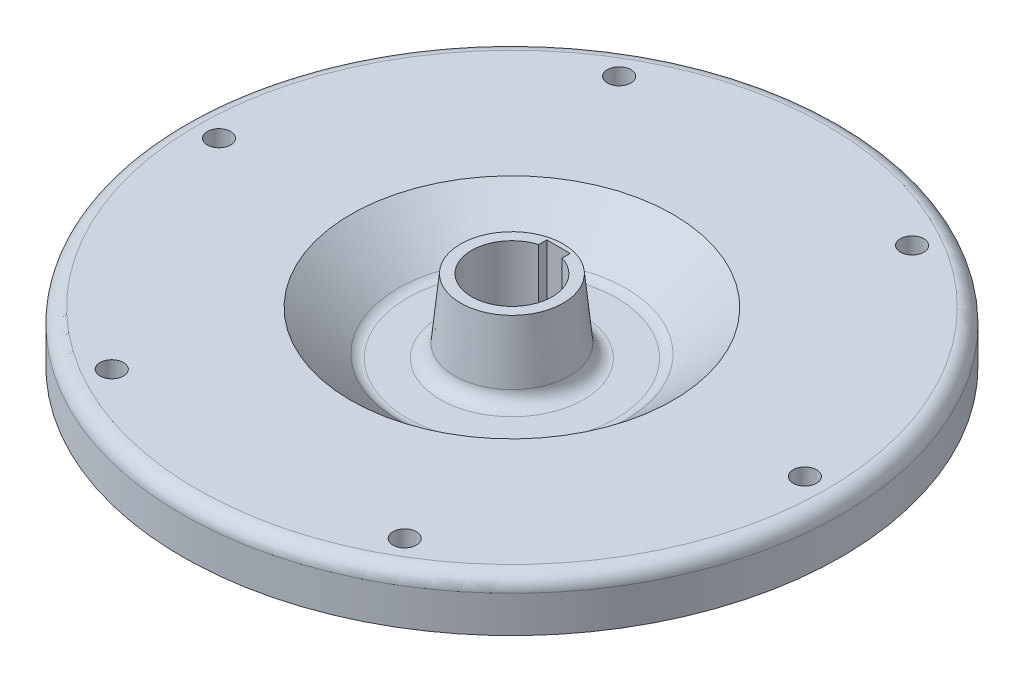
ISO-10303-21;
HEADER;
FILE_DESCRIPTION(('STEP AP214'),'2;1');
FILE_NAME('part.step','',(''),(''),'','','');
FILE_SCHEMA(('AUTOMOTIVE_DESIGN { 1 0 10303 214 1 1 1 1 }'));
ENDSEC;
DATA;
#1=APPLICATION_CONTEXT('core data for automotive mechanical design processes');
#2=APPLICATION_PROTOCOL_DEFINITION('international standard','automotive_design',2000,#1);
#3=PRODUCT_CONTEXT('',#1,'mechanical');
#4=PRODUCT('Part','Part','',(#3));
#5=PRODUCT_RELATED_PRODUCT_CATEGORY('part','',(#4));
#6=PRODUCT_DEFINITION_FORMATION('','',#4);
#7=PRODUCT_DEFINITION_CONTEXT('part definition',#1,'design');
#8=PRODUCT_DEFINITION('design','',#6,#7);
#9=PRODUCT_DEFINITION_SHAPE('','',#8);
#10=(LENGTH_UNIT() NAMED_UNIT(*) SI_UNIT(.MILLI.,.METRE.));
#11=(NAMED_UNIT(*) PLANE_ANGLE_UNIT() SI_UNIT($,.RADIAN.));
#12=(NAMED_UNIT(*) SI_UNIT($,.STERADIAN.) SOLID_ANGLE_UNIT());
#13=UNCERTAINTY_MEASURE_WITH_UNIT(LENGTH_MEASURE(1.E-05),#10,'distance_accuracy_value','');
#14=(GEOMETRIC_REPRESENTATION_CONTEXT(3) GLOBAL_UNCERTAINTY_ASSIGNED_CONTEXT((#13)) GLOBAL_UNIT_ASSIGNED_CONTEXT((#10,
#11,#12)) REPRESENTATION_CONTEXT('',''));
#15=CARTESIAN_POINT('',(0.,0.,0.));
#16=DIRECTION('',(0.,0.,1.));
#17=DIRECTION('',(1.,0.,0.));
#18=AXIS2_PLACEMENT_3D('',#15,#16,#17);
#19=CARTESIAN_POINT('',(0.,0.,0.));
#20=DIRECTION('',(0.,-1.,0.));
#21=DIRECTION('',(0.,0.,-1.));
#22=AXIS2_PLACEMENT_3D('',#19,#20,#21);
#23=CYLINDRICAL_SURFACE('',#22,27.5);
#24=DIRECTION('',(0.,1.,0.));
#25=VECTOR('',#24,1.);
#26=CARTESIAN_POINT('',(-8.,0.,-26.3106442338457));
#27=LINE('',#26,#25);
#28=CARTESIAN_POINT('',(-8.,0.,-26.3106442338457));
#29=VERTEX_POINT('',#28);
#30=CARTESIAN_POINT('',(-8.,160.,-26.3106442338457));
#31=VERTEX_POINT('',#30);
#32=EDGE_CURVE('E62',#29,#31,#27,.T.);
#33=ORIENTED_EDGE('',*,*,#32,.T.);
#34=CARTESIAN_POINT('',(0.,160.,0.));
#35=DIRECTION('',(0.,-1.,0.));
#36=DIRECTION('',(0.,0.,-1.));
#37=AXIS2_PLACEMENT_3D('',#34,#35,#36);
#38=CIRCLE('',#37,27.5);
#39=CARTESIAN_POINT('',(8.,160.,-26.3106442338457));
#40=VERTEX_POINT('',#39);
#41=EDGE_CURVE('E11',#40,#31,#38,.T.);
#42=ORIENTED_EDGE('',*,*,#41,.F.);
#43=DIRECTION('',(0.,1.,0.));
#44=VECTOR('',#43,1.);
#45=CARTESIAN_POINT('',(8.,0.,-26.3106442338457));
#46=LINE('',#45,#44);
#47=CARTESIAN_POINT('',(8.,0.,-26.3106442338457));
#48=VERTEX_POINT('',#47);
#49=EDGE_CURVE('E85',#48,#40,#46,.T.);
#50=ORIENTED_EDGE('',*,*,#49,.F.);
#51=CARTESIAN_POINT('',(0.,0.,0.));
#52=DIRECTION('',(0.,-1.,0.));
#53=DIRECTION('',(0.,0.,-1.));
#54=AXIS2_PLACEMENT_3D('',#51,#52,#53);
#55=CIRCLE('',#54,27.5);
#56=EDGE_CURVE('E94',#48,#29,#55,.T.);
#57=ORIENTED_EDGE('',*,*,#56,.T.);
#58=EDGE_LOOP('',(#33,#42,#50,#57));
#59=FACE_BOUND('',#58,.T.);
#60=ADVANCED_FACE('F37',(#59),#23,.F.);
#61=CARTESIAN_POINT('',(35.,160.,0.));
#62=DIRECTION('',(0.,1.,0.));
#63=DIRECTION('',(0.,0.,1.));
#64=AXIS2_PLACEMENT_3D('',#61,#62,#63);
#65=PLANE('',#64);
#66=DIRECTION('',(0.,0.,1.));
#67=VECTOR('',#66,1.);
#68=CARTESIAN_POINT('',(-8.,160.,-26.3106442338457));
#69=LINE('',#68,#67);
#70=CARTESIAN_POINT('',(-8.,160.,-31.8));
#71=VERTEX_POINT('',#70);
#72=EDGE_CURVE('E77',#71,#31,#69,.T.);
#73=ORIENTED_EDGE('',*,*,#72,.F.);
#74=DIRECTION('',(-1.,0.,0.));
#75=VECTOR('',#74,1.);
#76=CARTESIAN_POINT('',(-8.,160.,-31.8));
#77=LINE('',#76,#75);
#78=CARTESIAN_POINT('',(8.,160.,-31.8));
#79=VERTEX_POINT('',#78);
#80=EDGE_CURVE('E495',#79,#71,#77,.T.);
#81=ORIENTED_EDGE('',*,*,#80,.F.);
#82=DIRECTION('',(0.,0.,-1.));
#83=VECTOR('',#82,1.);
#84=CARTESIAN_POINT('',(8.,160.,-31.8));
#85=LINE('',#84,#83);
#86=EDGE_CURVE('E497',#40,#79,#85,.T.);
#87=ORIENTED_EDGE('',*,*,#86,.F.);
#88=ORIENTED_EDGE('',*,*,#41,.T.);
#89=EDGE_LOOP('',(#73,#81,#87,#88));
#90=FACE_BOUND('',#89,.T.);
#91=CARTESIAN_POINT('',(0.,160.,0.));
#92=DIRECTION('',(0.,-1.,0.));
#93=DIRECTION('',(0.,0.,-1.));
#94=AXIS2_PLACEMENT_3D('',#91,#92,#93);
#95=CIRCLE('',#94,35.);
#96=CARTESIAN_POINT('',(0.,160.,-35.));
#97=VERTEX_POINT('',#96);
#98=EDGE_CURVE('E45',#97,#97,#95,.T.);
#99=ORIENTED_EDGE('',*,*,#98,.F.);
#100=EDGE_LOOP('',(#99));
#101=FACE_BOUND('',#100,.T.);
#102=ADVANCED_FACE('F226',(#90,#101),#65,.T.);
#103=CARTESIAN_POINT('',(0.,119.00496280979,0.));
#104=DIRECTION('',(0.,-1.,0.));
#105=DIRECTION('',(0.,0.,-1.));
#106=AXIS2_PLACEMENT_3D('',#103,#104,#105);
#107=CONICAL_SURFACE('',#106,39.099503719021,0.0996686524911624);
#108=ORIENTED_EDGE('',*,*,#98,.T.);
#109=EDGE_LOOP('',(#108));
#110=FACE_BOUND('',#109,.T.);
#111=CARTESIAN_POINT('',(0.,119.00496280979,0.));
#112=DIRECTION('',(0.,-1.,0.));
#113=DIRECTION('',(0.,0.,-1.));
#114=AXIS2_PLACEMENT_3D('',#111,#112,#113);
#115=CIRCLE('',#114,39.099503719021);
#116=CARTESIAN_POINT('',(0.,119.00496280979,-39.099503719021));
#117=VERTEX_POINT('',#116);
#118=EDGE_CURVE('E145',#117,#117,#115,.T.);
#119=ORIENTED_EDGE('',*,*,#118,.F.);
#120=EDGE_LOOP('',(#119));
#121=FACE_BOUND('',#120,.T.);
#122=ADVANCED_FACE('F230',(#110,#121),#107,.T.);
#123=CARTESIAN_POINT('',(0.,120.,0.));
#124=DIRECTION('',(0.,-1.,0.));
#125=DIRECTION('',(0.,0.,-1.));
#126=AXIS2_PLACEMENT_3D('',#123,#124,#125);
#127=TOROIDAL_SURFACE('',#126,49.0498756211209,10.);
#128=ORIENTED_EDGE('',*,*,#118,.T.);
#129=EDGE_LOOP('',(#128));
#130=FACE_BOUND('',#129,.T.);
#131=CARTESIAN_POINT('',(0.,110.,0.));
#132=DIRECTION('',(0.,-1.,0.));
#133=DIRECTION('',(0.,0.,-1.));
#134=AXIS2_PLACEMENT_3D('',#131,#132,#133);
#135=CIRCLE('',#134,49.0498756211209);
#136=CARTESIAN_POINT('',(0.,110.,-49.0498756211209));
#137=VERTEX_POINT('',#136);
#138=EDGE_CURVE('E142',#137,#137,#135,.T.);
#139=ORIENTED_EDGE('',*,*,#138,.F.);
#140=EDGE_LOOP('',(#139));
#141=FACE_BOUND('',#140,.T.);
#142=ADVANCED_FACE('F235',(#130,#141),#127,.F.);
#143=CARTESIAN_POINT('',(71.3007592378452,110.,0.));
#144=DIRECTION('',(0.,1.,0.));
#145=DIRECTION('',(0.,0.,1.));
#146=AXIS2_PLACEMENT_3D('',#143,#144,#145);
#147=PLANE('',#146);
#148=ORIENTED_EDGE('',*,*,#138,.T.);
#149=EDGE_LOOP('',(#148));
#150=FACE_BOUND('',#149,.T.);
#151=CARTESIAN_POINT('',(0.,110.,0.));
#152=DIRECTION('',(0.,-1.,0.));
#153=DIRECTION('',(0.,0.,-1.));
#154=AXIS2_PLACEMENT_3D('',#151,#152,#153);
#155=CIRCLE('',#154,71.3007592378452);
#156=CARTESIAN_POINT('',(0.,110.,-71.3007592378452));
#157=VERTEX_POINT('',#156);
#158=EDGE_CURVE('E139',#157,#157,#155,.T.);
#159=ORIENTED_EDGE('',*,*,#158,.F.);
#160=EDGE_LOOP('',(#159));
#161=FACE_BOUND('',#160,.T.);
#162=ADVANCED_FACE('F242',(#150,#161),#147,.T.);
#163=CARTESIAN_POINT('',(0.,120.,0.));
#164=DIRECTION('',(0.,-1.,0.));
#165=DIRECTION('',(0.,0.,-1.));
#166=AXIS2_PLACEMENT_3D('',#163,#164,#165);
#167=TOROIDAL_SURFACE('',#166,71.3007592378452,10.);
#168=ORIENTED_EDGE('',*,*,#158,.T.);
#169=EDGE_LOOP('',(#168));
#170=FACE_BOUND('',#169,.T.);
#171=CARTESIAN_POINT('',(0.,112.407433976347,0.));
#172=DIRECTION('',(0.,-1.,0.));
#173=DIRECTION('',(0.,0.,-1.));
#174=AXIS2_PLACEMENT_3D('',#171,#172,#173);
#175=CIRCLE('',#174,77.8086729724048);
#176=CARTESIAN_POINT('',(0.,112.407433976347,-77.8086729724048));
#177=VERTEX_POINT('',#176);
#178=EDGE_CURVE('E136',#177,#177,#175,.T.);
#179=ORIENTED_EDGE('',*,*,#178,.F.);
#180=EDGE_LOOP('',(#179));
#181=FACE_BOUND('',#180,.T.);
#182=ADVANCED_FACE('F246',(#170,#181),#167,.F.);
#183=CARTESIAN_POINT('',(0.,140.,0.));
#184=DIRECTION('',(0.,1.,0.));
#185=DIRECTION('',(0.,0.,1.));
#186=AXIS2_PLACEMENT_3D('',#183,#184,#185);
#187=CONICAL_SURFACE('',#186,110.,0.862170054667227);
#188=ORIENTED_EDGE('',*,*,#178,.T.);
#189=EDGE_LOOP('',(#188));
#190=FACE_BOUND('',#189,.T.);
#191=CARTESIAN_POINT('',(0.,140.,0.));
#192=DIRECTION('',(0.,-1.,0.));
#193=DIRECTION('',(0.,0.,-1.));
#194=AXIS2_PLACEMENT_3D('',#191,#192,#193);
#195=CIRCLE('',#194,110.);
#196=CARTESIAN_POINT('',(0.,140.,-110.));
#197=VERTEX_POINT('',#196);
#198=EDGE_CURVE('E133',#197,#197,#195,.T.);
#199=ORIENTED_EDGE('',*,*,#198,.F.);
#200=EDGE_LOOP('',(#199));
#201=FACE_BOUND('',#200,.T.);
#202=ADVANCED_FACE('F250',(#190,#201),#187,.F.);
#203=CARTESIAN_POINT('',(215.,140.,0.));
#204=DIRECTION('',(0.,1.,0.));
#205=DIRECTION('',(0.,0.,1.));
#206=AXIS2_PLACEMENT_3D('',#203,#204,#205);
#207=PLANE('',#206);
#208=CARTESIAN_POINT('',(200.,140.,0.));
#209=DIRECTION('',(0.,1.,0.));
#210=DIRECTION('',(0.,0.,1.));
#211=AXIS2_PLACEMENT_3D('',#208,#209,#210);
#212=CIRCLE('',#211,8.00000000000001);
#213=CARTESIAN_POINT('',(200.,140.,8.00000000000001));
#214=VERTEX_POINT('',#213);
#215=EDGE_CURVE('E154',#214,#214,#212,.T.);
#216=ORIENTED_EDGE('',*,*,#215,.F.);
#217=EDGE_LOOP('',(#216));
#218=FACE_BOUND('',#217,.T.);
#219=CARTESIAN_POINT('',(99.9999999999999,140.,-173.205080756888));
#220=DIRECTION('',(0.,1.,0.));
#221=DIRECTION('',(0.,0.,1.));
#222=AXIS2_PLACEMENT_3D('',#219,#220,#221);
#223=CIRCLE('',#222,8.00000000000003);
#224=CARTESIAN_POINT('',(99.9999999999999,140.,-165.205080756888));
#225=VERTEX_POINT('',#224);
#226=EDGE_CURVE('E503',#225,#225,#223,.T.);
#227=ORIENTED_EDGE('',*,*,#226,.F.);
#228=EDGE_LOOP('',(#227));
#229=FACE_BOUND('',#228,.T.);
#230=CARTESIAN_POINT('',(-100.,140.,-173.205080756888));
#231=DIRECTION('',(0.,1.,0.));
#232=DIRECTION('',(0.,0.,1.));
#233=AXIS2_PLACEMENT_3D('',#230,#231,#232);
#234=CIRCLE('',#233,8.00000000000001);
#235=CARTESIAN_POINT('',(-100.,140.,-165.205080756888));
#236=VERTEX_POINT('',#235);
#237=EDGE_CURVE('E107',#236,#236,#234,.T.);
#238=ORIENTED_EDGE('',*,*,#237,.F.);
#239=EDGE_LOOP('',(#238));
#240=FACE_BOUND('',#239,.T.);
#241=CARTESIAN_POINT('',(-200.,140.,0.));
#242=DIRECTION('',(0.,1.,0.));
#243=DIRECTION('',(0.,0.,1.));
#244=AXIS2_PLACEMENT_3D('',#241,#242,#243);
#245=CIRCLE('',#244,8.00000000000004);
#246=CARTESIAN_POINT('',(-200.,140.,8.00000000000007));
#247=VERTEX_POINT('',#246);
#248=EDGE_CURVE('E515',#247,#247,#245,.T.);
#249=ORIENTED_EDGE('',*,*,#248,.F.);
#250=EDGE_LOOP('',(#249));
#251=FACE_BOUND('',#250,.T.);
#252=CARTESIAN_POINT('',(-100.,140.,173.205080756888));
#253=DIRECTION('',(0.,1.,0.));
#254=DIRECTION('',(0.,0.,1.));
#255=AXIS2_PLACEMENT_3D('',#252,#253,#254);
#256=CIRCLE('',#255,8.00000000000001);
#257=CARTESIAN_POINT('',(-100.,140.,181.205080756888));
#258=VERTEX_POINT('',#257);
#259=EDGE_CURVE('E513',#258,#258,#256,.T.);
#260=ORIENTED_EDGE('',*,*,#259,.F.);
#261=EDGE_LOOP('',(#260));
#262=FACE_BOUND('',#261,.T.);
#263=CARTESIAN_POINT('',(100.,140.,173.205080756888));
#264=DIRECTION('',(0.,1.,0.));
#265=DIRECTION('',(0.,0.,1.));
#266=AXIS2_PLACEMENT_3D('',#263,#264,#265);
#267=CIRCLE('',#266,8.00000000000001);
#268=CARTESIAN_POINT('',(100.,140.,181.205080756888));
#269=VERTEX_POINT('',#268);
#270=EDGE_CURVE('E508',#269,#269,#267,.T.);
#271=ORIENTED_EDGE('',*,*,#270,.F.);
#272=EDGE_LOOP('',(#271));
#273=FACE_BOUND('',#272,.T.);
#274=ORIENTED_EDGE('',*,*,#198,.T.);
#275=EDGE_LOOP('',(#274));
#276=FACE_BOUND('',#275,.T.);
#277=CARTESIAN_POINT('',(0.,140.,0.));
#278=DIRECTION('',(0.,-1.,0.));
#279=DIRECTION('',(0.,0.,-1.));
#280=AXIS2_PLACEMENT_3D('',#277,#278,#279);
#281=CIRCLE('',#280,215.);
#282=CARTESIAN_POINT('',(0.,140.,-215.));
#283=VERTEX_POINT('',#282);
#284=EDGE_CURVE('E130',#283,#283,#281,.T.);
#285=ORIENTED_EDGE('',*,*,#284,.F.);
#286=EDGE_LOOP('',(#285));
#287=FACE_BOUND('',#286,.T.);
#288=ADVANCED_FACE('F254',(#218,#229,#240,#251,#262,#273,#276,#287),#207,.T.);
#289=CARTESIAN_POINT('',(0.,130.,0.));
#290=DIRECTION('',(0.,-1.,0.));
#291=DIRECTION('',(0.,0.,-1.));
#292=AXIS2_PLACEMENT_3D('',#289,#290,#291);
#293=TOROIDAL_SURFACE('',#292,215.,9.99999999999999);
#294=ORIENTED_EDGE('',*,*,#284,.T.);
#295=EDGE_LOOP('',(#294));
#296=FACE_BOUND('',#295,.T.);
#297=CARTESIAN_POINT('',(0.,130.,0.));
#298=DIRECTION('',(0.,-1.,0.));
#299=DIRECTION('',(0.,0.,-1.));
#300=AXIS2_PLACEMENT_3D('',#297,#298,#299);
#301=CIRCLE('',#300,225.);
#302=CARTESIAN_POINT('',(0.,130.,-225.));
#303=VERTEX_POINT('',#302);
#304=EDGE_CURVE('E127',#303,#303,#301,.T.);
#305=ORIENTED_EDGE('',*,*,#304,.F.);
#306=EDGE_LOOP('',(#305));
#307=FACE_BOUND('',#306,.T.);
#308=ADVANCED_FACE('F258',(#296,#307),#293,.T.);
#309=CARTESIAN_POINT('',(0.,0.,0.));
#310=DIRECTION('',(0.,-1.,0.));
#311=DIRECTION('',(0.,0.,-1.));
#312=AXIS2_PLACEMENT_3D('',#309,#310,#311);
#313=CYLINDRICAL_SURFACE('',#312,225.);
#314=ORIENTED_EDGE('',*,*,#304,.T.);
#315=EDGE_LOOP('',(#314));
#316=FACE_BOUND('',#315,.T.);
#317=CARTESIAN_POINT('',(0.,105.,0.));
#318=DIRECTION('',(0.,-1.,0.));
#319=DIRECTION('',(0.,0.,-1.));
#320=AXIS2_PLACEMENT_3D('',#317,#318,#319);
#321=CIRCLE('',#320,225.);
#322=CARTESIAN_POINT('',(0.,105.,-225.));
#323=VERTEX_POINT('',#322);
#324=EDGE_CURVE('E124',#323,#323,#321,.T.);
#325=ORIENTED_EDGE('',*,*,#324,.F.);
#326=EDGE_LOOP('',(#325));
#327=FACE_BOUND('',#326,.T.);
#328=ADVANCED_FACE('F172',(#316,#327),#313,.T.);
#329=CARTESIAN_POINT('',(175.,105.,0.));
#330=DIRECTION('',(0.,-1.,0.));
#331=DIRECTION('',(0.,0.,-1.));
#332=AXIS2_PLACEMENT_3D('',#329,#330,#331);
#333=PLANE('',#332);
#334=CARTESIAN_POINT('',(200.,105.,0.));
#335=DIRECTION('',(0.,-1.,0.));
#336=DIRECTION('',(0.,0.,-1.));
#337=AXIS2_PLACEMENT_3D('',#334,#335,#336);
#338=CIRCLE('',#337,8.00000000000001);
#339=CARTESIAN_POINT('',(200.,105.,-8.00000000000001));
#340=VERTEX_POINT('',#339);
#341=EDGE_CURVE('E40',#340,#340,#338,.T.);
#342=ORIENTED_EDGE('',*,*,#341,.F.);
#343=EDGE_LOOP('',(#342));
#344=FACE_BOUND('',#343,.T.);
#345=CARTESIAN_POINT('',(99.9999999999999,105.,-173.205080756888));
#346=DIRECTION('',(0.,-1.,0.));
#347=DIRECTION('',(0.,0.,-1.));
#348=AXIS2_PLACEMENT_3D('',#345,#346,#347);
#349=CIRCLE('',#348,8.00000000000003);
#350=CARTESIAN_POINT('',(99.9999999999999,105.,-181.205080756888));
#351=VERTEX_POINT('',#350);
#352=EDGE_CURVE('E105',#351,#351,#349,.T.);
#353=ORIENTED_EDGE('',*,*,#352,.F.);
#354=EDGE_LOOP('',(#353));
#355=FACE_BOUND('',#354,.T.);
#356=CARTESIAN_POINT('',(-100.,105.,-173.205080756888));
#357=DIRECTION('',(0.,-1.,0.));
#358=DIRECTION('',(0.,0.,-1.));
#359=AXIS2_PLACEMENT_3D('',#356,#357,#358);
#360=CIRCLE('',#359,8.00000000000001);
#361=CARTESIAN_POINT('',(-100.,105.,-181.205080756888));
#362=VERTEX_POINT('',#361);
#363=EDGE_CURVE('E160',#362,#362,#360,.T.);
#364=ORIENTED_EDGE('',*,*,#363,.F.);
#365=EDGE_LOOP('',(#364));
#366=FACE_BOUND('',#365,.T.);
#367=CARTESIAN_POINT('',(-200.,105.,0.));
#368=DIRECTION('',(0.,-1.,0.));
#369=DIRECTION('',(0.,0.,-1.));
#370=AXIS2_PLACEMENT_3D('',#367,#368,#369);
#371=CIRCLE('',#370,8.00000000000004);
#372=CARTESIAN_POINT('',(-200.,105.,-8.00000000000001));
#373=VERTEX_POINT('',#372);
#374=EDGE_CURVE('E157',#373,#373,#371,.T.);
#375=ORIENTED_EDGE('',*,*,#374,.F.);
#376=EDGE_LOOP('',(#375));
#377=FACE_BOUND('',#376,.T.);
#378=CARTESIAN_POINT('',(-100.,105.,173.205080756888));
#379=DIRECTION('',(0.,-1.,0.));
#380=DIRECTION('',(0.,0.,-1.));
#381=AXIS2_PLACEMENT_3D('',#378,#379,#380);
#382=CIRCLE('',#381,8.00000000000001);
#383=CARTESIAN_POINT('',(-100.,105.,165.205080756888));
#384=VERTEX_POINT('',#383);
#385=EDGE_CURVE('E153',#384,#384,#382,.T.);
#386=ORIENTED_EDGE('',*,*,#385,.F.);
#387=EDGE_LOOP('',(#386));
#388=FACE_BOUND('',#387,.T.);
#389=CARTESIAN_POINT('',(100.,105.,173.205080756888));
#390=DIRECTION('',(0.,-1.,0.));
#391=DIRECTION('',(0.,0.,-1.));
#392=AXIS2_PLACEMENT_3D('',#389,#390,#391);
#393=CIRCLE('',#392,8.00000000000001);
#394=CARTESIAN_POINT('',(100.,105.,165.205080756888));
#395=VERTEX_POINT('',#394);
#396=EDGE_CURVE('E150',#395,#395,#393,.T.);
#397=ORIENTED_EDGE('',*,*,#396,.F.);
#398=EDGE_LOOP('',(#397));
#399=FACE_BOUND('',#398,.T.);
#400=ORIENTED_EDGE('',*,*,#324,.T.);
#401=EDGE_LOOP('',(#400));
#402=FACE_BOUND('',#401,.T.);
#403=CARTESIAN_POINT('',(0.,105.,0.));
#404=DIRECTION('',(0.,-1.,0.));
#405=DIRECTION('',(0.,0.,-1.));
#406=AXIS2_PLACEMENT_3D('',#403,#404,#405);
#407=CIRCLE('',#406,175.);
#408=CARTESIAN_POINT('',(0.,105.,-175.));
#409=VERTEX_POINT('',#408);
#410=EDGE_CURVE('E121',#409,#409,#407,.T.);
#411=ORIENTED_EDGE('',*,*,#410,.F.);
#412=EDGE_LOOP('',(#411));
#413=FACE_BOUND('',#412,.T.);
#414=ADVANCED_FACE('F168',(#344,#355,#366,#377,#388,#399,#402,#413),#333,.T.);
#415=CARTESIAN_POINT('',(0.,0.,0.));
#416=DIRECTION('',(0.,-1.,0.));
#417=DIRECTION('',(0.,0.,-1.));
#418=AXIS2_PLACEMENT_3D('',#415,#416,#417);
#419=CYLINDRICAL_SURFACE('',#418,175.);
#420=ORIENTED_EDGE('',*,*,#410,.T.);
#421=EDGE_LOOP('',(#420));
#422=FACE_BOUND('',#421,.T.);
#423=CARTESIAN_POINT('',(0.,70.,0.));
#424=DIRECTION('',(0.,-1.,0.));
#425=DIRECTION('',(0.,0.,-1.));
#426=AXIS2_PLACEMENT_3D('',#423,#424,#425);
#427=CIRCLE('',#426,175.);
#428=CARTESIAN_POINT('',(0.,70.,-175.));
#429=VERTEX_POINT('',#428);
#430=EDGE_CURVE('E118',#429,#429,#427,.T.);
#431=ORIENTED_EDGE('',*,*,#430,.F.);
#432=EDGE_LOOP('',(#431));
#433=FACE_BOUND('',#432,.T.);
#434=ADVANCED_FACE('F171',(#422,#433),#419,.T.);
#435=CARTESIAN_POINT('',(110.,70.,0.));
#436=DIRECTION('',(0.,-1.,0.));
#437=DIRECTION('',(0.,0.,-1.));
#438=AXIS2_PLACEMENT_3D('',#435,#436,#437);
#439=PLANE('',#438);
#440=ORIENTED_EDGE('',*,*,#430,.T.);
#441=EDGE_LOOP('',(#440));
#442=FACE_BOUND('',#441,.T.);
#443=CARTESIAN_POINT('',(0.,70.,0.));
#444=DIRECTION('',(0.,-1.,0.));
#445=DIRECTION('',(0.,0.,-1.));
#446=AXIS2_PLACEMENT_3D('',#443,#444,#445);
#447=CIRCLE('',#446,110.);
#448=CARTESIAN_POINT('',(0.,70.,-110.));
#449=VERTEX_POINT('',#448);
#450=EDGE_CURVE('E115',#449,#449,#447,.T.);
#451=ORIENTED_EDGE('',*,*,#450,.F.);
#452=EDGE_LOOP('',(#451));
#453=FACE_BOUND('',#452,.T.);
#454=ADVANCED_FACE('F189',(#442,#453),#439,.T.);
#455=CARTESIAN_POINT('',(0.,35.,0.));
#456=DIRECTION('',(0.,-1.,0.));
#457=DIRECTION('',(0.,0.,-1.));
#458=AXIS2_PLACEMENT_3D('',#455,#456,#457);
#459=TOROIDAL_SURFACE('',#458,110.,35.);
#460=ORIENTED_EDGE('',*,*,#450,.T.);
#461=EDGE_LOOP('',(#460));
#462=FACE_BOUND('',#461,.T.);
#463=CARTESIAN_POINT('',(0.,35.,0.));
#464=DIRECTION('',(0.,-1.,0.));
#465=DIRECTION('',(0.,0.,-1.));
#466=AXIS2_PLACEMENT_3D('',#463,#464,#465);
#467=CIRCLE('',#466,75.);
#468=CARTESIAN_POINT('',(0.,35.,-75.));
#469=VERTEX_POINT('',#468);
#470=EDGE_CURVE('E112',#469,#469,#467,.T.);
#471=ORIENTED_EDGE('',*,*,#470,.F.);
#472=EDGE_LOOP('',(#471));
#473=FACE_BOUND('',#472,.T.);
#474=ADVANCED_FACE('F195',(#462,#473),#459,.F.);
#475=CARTESIAN_POINT('',(0.,0.,0.));
#476=DIRECTION('',(0.,-1.,0.));
#477=DIRECTION('',(0.,0.,-1.));
#478=AXIS2_PLACEMENT_3D('',#475,#476,#477);
#479=CYLINDRICAL_SURFACE('',#478,75.);
#480=ORIENTED_EDGE('',*,*,#470,.T.);
#481=EDGE_LOOP('',(#480));
#482=FACE_BOUND('',#481,.T.);
#483=CARTESIAN_POINT('',(0.,10.,0.));
#484=DIRECTION('',(0.,-1.,0.));
#485=DIRECTION('',(0.,0.,-1.));
#486=AXIS2_PLACEMENT_3D('',#483,#484,#485);
#487=CIRCLE('',#486,75.);
#488=CARTESIAN_POINT('',(0.,10.,-75.));
#489=VERTEX_POINT('',#488);
#490=EDGE_CURVE('E102',#489,#489,#487,.T.);
#491=ORIENTED_EDGE('',*,*,#490,.F.);
#492=EDGE_LOOP('',(#491));
#493=FACE_BOUND('',#492,.T.);
#494=ADVANCED_FACE('F201',(#482,#493),#479,.T.);
#495=CARTESIAN_POINT('',(0.,10.,0.));
#496=DIRECTION('',(0.,-1.,0.));
#497=DIRECTION('',(0.,0.,-1.));
#498=AXIS2_PLACEMENT_3D('',#495,#496,#497);
#499=TOROIDAL_SURFACE('',#498,65.,10.);
#500=ORIENTED_EDGE('',*,*,#490,.T.);
#501=EDGE_LOOP('',(#500));
#502=FACE_BOUND('',#501,.T.);
#503=CARTESIAN_POINT('',(0.,0.,0.));
#504=DIRECTION('',(0.,-1.,0.));
#505=DIRECTION('',(0.,0.,-1.));
#506=AXIS2_PLACEMENT_3D('',#503,#504,#505);
#507=CIRCLE('',#506,64.9999999999999);
#508=CARTESIAN_POINT('',(0.,0.,-64.9999999999999));
#509=VERTEX_POINT('',#508);
#510=EDGE_CURVE('E99',#509,#509,#507,.T.);
#511=ORIENTED_EDGE('',*,*,#510,.F.);
#512=EDGE_LOOP('',(#511));
#513=FACE_BOUND('',#512,.T.);
#514=ADVANCED_FACE('F207',(#502,#513),#499,.T.);
#515=CARTESIAN_POINT('',(27.5,0.,0.));
#516=DIRECTION('',(0.,-1.,0.));
#517=DIRECTION('',(0.,0.,-1.));
#518=AXIS2_PLACEMENT_3D('',#515,#516,#517);
#519=PLANE('',#518);
#520=DIRECTION('',(0.,0.,1.));
#521=VECTOR('',#520,1.);
#522=CARTESIAN_POINT('',(-8.,0.,-26.3106442338457));
#523=LINE('',#522,#521);
#524=CARTESIAN_POINT('',(-8.,0.,-31.8));
#525=VERTEX_POINT('',#524);
#526=EDGE_CURVE('E95',#525,#29,#523,.T.);
#527=ORIENTED_EDGE('',*,*,#526,.T.);
#528=ORIENTED_EDGE('',*,*,#56,.F.);
#529=DIRECTION('',(0.,0.,-1.));
#530=VECTOR('',#529,1.);
#531=CARTESIAN_POINT('',(8.,0.,-31.8));
#532=LINE('',#531,#530);
#533=CARTESIAN_POINT('',(8.,0.,-31.8));
#534=VERTEX_POINT('',#533);
#535=EDGE_CURVE('E81',#48,#534,#532,.T.);
#536=ORIENTED_EDGE('',*,*,#535,.T.);
#537=DIRECTION('',(-1.,0.,0.));
#538=VECTOR('',#537,1.);
#539=CARTESIAN_POINT('',(-8.,0.,-31.8));
#540=LINE('',#539,#538);
#541=EDGE_CURVE('E53',#534,#525,#540,.T.);
#542=ORIENTED_EDGE('',*,*,#541,.T.);
#543=EDGE_LOOP('',(#527,#528,#536,#542));
#544=FACE_BOUND('',#543,.T.);
#545=ORIENTED_EDGE('',*,*,#510,.T.);
#546=EDGE_LOOP('',(#545));
#547=FACE_BOUND('',#546,.T.);
#548=ADVANCED_FACE('F97',(#544,#547),#519,.T.);
#549=CARTESIAN_POINT('',(100.,0.,173.205080756888));
#550=DIRECTION('',(0.,1.,0.));
#551=DIRECTION('',(0.,0.,1.));
#552=AXIS2_PLACEMENT_3D('',#549,#550,#551);
#553=CYLINDRICAL_SURFACE('',#552,8.00000000000001);
#554=ORIENTED_EDGE('',*,*,#396,.T.);
#555=EDGE_LOOP('',(#554));
#556=FACE_BOUND('',#555,.T.);
#557=ORIENTED_EDGE('',*,*,#270,.T.);
#558=EDGE_LOOP('',(#557));
#559=FACE_BOUND('',#558,.T.);
#560=ADVANCED_FACE('F216',(#556,#559),#553,.F.);
#561=CARTESIAN_POINT('',(-100.,0.,173.205080756888));
#562=DIRECTION('',(0.,1.,0.));
#563=DIRECTION('',(0.,0.,1.));
#564=AXIS2_PLACEMENT_3D('',#561,#562,#563);
#565=CYLINDRICAL_SURFACE('',#564,8.00000000000001);
#566=ORIENTED_EDGE('',*,*,#385,.T.);
#567=EDGE_LOOP('',(#566));
#568=FACE_BOUND('',#567,.T.);
#569=ORIENTED_EDGE('',*,*,#259,.T.);
#570=EDGE_LOOP('',(#569));
#571=FACE_BOUND('',#570,.T.);
#572=ADVANCED_FACE('F221',(#568,#571),#565,.F.);
#573=CARTESIAN_POINT('',(-200.,0.,0.));
#574=DIRECTION('',(0.,1.,0.));
#575=DIRECTION('',(0.,0.,1.));
#576=AXIS2_PLACEMENT_3D('',#573,#574,#575);
#577=CYLINDRICAL_SURFACE('',#576,8.00000000000004);
#578=ORIENTED_EDGE('',*,*,#374,.T.);
#579=EDGE_LOOP('',(#578));
#580=FACE_BOUND('',#579,.T.);
#581=ORIENTED_EDGE('',*,*,#248,.T.);
#582=EDGE_LOOP('',(#581));
#583=FACE_BOUND('',#582,.T.);
#584=ADVANCED_FACE('F400',(#580,#583),#577,.F.);
#585=CARTESIAN_POINT('',(-100.,0.,-173.205080756888));
#586=DIRECTION('',(0.,1.,0.));
#587=DIRECTION('',(0.,0.,1.));
#588=AXIS2_PLACEMENT_3D('',#585,#586,#587);
#589=CYLINDRICAL_SURFACE('',#588,8.00000000000001);
#590=ORIENTED_EDGE('',*,*,#363,.T.);
#591=EDGE_LOOP('',(#590));
#592=FACE_BOUND('',#591,.T.);
#593=ORIENTED_EDGE('',*,*,#237,.T.);
#594=EDGE_LOOP('',(#593));
#595=FACE_BOUND('',#594,.T.);
#596=ADVANCED_FACE('F410',(#592,#595),#589,.F.);
#597=CARTESIAN_POINT('',(99.9999999999999,0.,-173.205080756888));
#598=DIRECTION('',(0.,1.,0.));
#599=DIRECTION('',(0.,0.,1.));
#600=AXIS2_PLACEMENT_3D('',#597,#598,#599);
#601=CYLINDRICAL_SURFACE('',#600,8.00000000000003);
#602=ORIENTED_EDGE('',*,*,#352,.T.);
#603=EDGE_LOOP('',(#602));
#604=FACE_BOUND('',#603,.T.);
#605=ORIENTED_EDGE('',*,*,#226,.T.);
#606=EDGE_LOOP('',(#605));
#607=FACE_BOUND('',#606,.T.);
#608=ADVANCED_FACE('F165',(#604,#607),#601,.F.);
#609=CARTESIAN_POINT('',(200.,0.,0.));
#610=DIRECTION('',(0.,1.,0.));
#611=DIRECTION('',(0.,0.,1.));
#612=AXIS2_PLACEMENT_3D('',#609,#610,#611);
#613=CYLINDRICAL_SURFACE('',#612,8.00000000000001);
#614=ORIENTED_EDGE('',*,*,#341,.T.);
#615=EDGE_LOOP('',(#614));
#616=FACE_BOUND('',#615,.T.);
#617=ORIENTED_EDGE('',*,*,#215,.T.);
#618=EDGE_LOOP('',(#617));
#619=FACE_BOUND('',#618,.T.);
#620=ADVANCED_FACE('F428',(#616,#619),#613,.F.);
#621=CARTESIAN_POINT('',(-8.,0.,-26.3106442338457));
#622=DIRECTION('',(-1.,0.,0.));
#623=DIRECTION('',(0.,0.,1.));
#624=AXIS2_PLACEMENT_3D('',#621,#622,#623);
#625=PLANE('',#624);
#626=ORIENTED_EDGE('',*,*,#72,.T.);
#627=ORIENTED_EDGE('',*,*,#32,.F.);
#628=ORIENTED_EDGE('',*,*,#526,.F.);
#629=DIRECTION('',(0.,1.,0.));
#630=VECTOR('',#629,1.);
#631=CARTESIAN_POINT('',(-8.,0.,-31.8));
#632=LINE('',#631,#630);
#633=EDGE_CURVE('E496',#525,#71,#632,.T.);
#634=ORIENTED_EDGE('',*,*,#633,.T.);
#635=EDGE_LOOP('',(#626,#627,#628,#634));
#636=FACE_BOUND('',#635,.T.);
#637=ADVANCED_FACE('F437',(#636),#625,.F.);
#638=CARTESIAN_POINT('',(-8.,0.,-31.8));
#639=DIRECTION('',(0.,0.,-1.));
#640=DIRECTION('',(-1.,0.,0.));
#641=AXIS2_PLACEMENT_3D('',#638,#639,#640);
#642=PLANE('',#641);
#643=ORIENTED_EDGE('',*,*,#80,.T.);
#644=ORIENTED_EDGE('',*,*,#633,.F.);
#645=ORIENTED_EDGE('',*,*,#541,.F.);
#646=DIRECTION('',(0.,1.,0.));
#647=VECTOR('',#646,1.);
#648=CARTESIAN_POINT('',(8.,0.,-31.8));
#649=LINE('',#648,#647);
#650=EDGE_CURVE('E87',#534,#79,#649,.T.);
#651=ORIENTED_EDGE('',*,*,#650,.T.);
#652=EDGE_LOOP('',(#643,#644,#645,#651));
#653=FACE_BOUND('',#652,.T.);
#654=ADVANCED_FACE('F447',(#653),#642,.F.);
#655=CARTESIAN_POINT('',(8.,0.,-31.8));
#656=DIRECTION('',(1.,0.,0.));
#657=DIRECTION('',(0.,0.,-1.));
#658=AXIS2_PLACEMENT_3D('',#655,#656,#657);
#659=PLANE('',#658);
#660=ORIENTED_EDGE('',*,*,#86,.T.);
#661=ORIENTED_EDGE('',*,*,#650,.F.);
#662=ORIENTED_EDGE('',*,*,#535,.F.);
#663=ORIENTED_EDGE('',*,*,#49,.T.);
#664=EDGE_LOOP('',(#660,#661,#662,#663));
#665=FACE_BOUND('',#664,.T.);
#666=ADVANCED_FACE('F84',(#665),#659,.F.);
#667=CLOSED_SHELL('',(#60,#102,#122,#142,#162,#182,#202,#288,#308,#328,#414,#434,#454,#474,#494,
#514,#548,#560,#572,#584,#596,#608,#620,#637,#654,#666));
#668=MANIFOLD_SOLID_BREP('B2',#667);
#669=ADVANCED_BREP_SHAPE_REPRESENTATION('',(#18,#668),#14);
#670=SHAPE_DEFINITION_REPRESENTATION(#9,#669);
ENDSEC;
END-ISO-10303-21;
